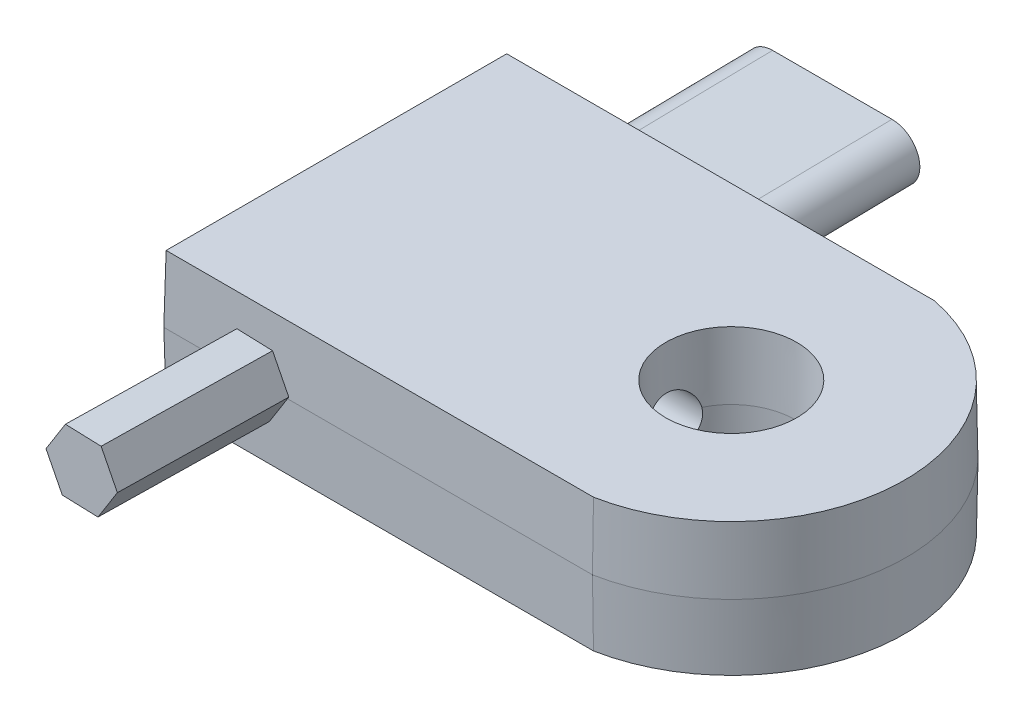
ISO-10303-21;
HEADER;
FILE_DESCRIPTION(('STEP AP214'),'2;1');
FILE_NAME('part.step','',(''),(''),'','','');
FILE_SCHEMA(('AUTOMOTIVE_DESIGN { 1 0 10303 214 1 1 1 1 }'));
ENDSEC;
DATA;
#1=APPLICATION_CONTEXT('core data for automotive mechanical design processes');
#2=APPLICATION_PROTOCOL_DEFINITION('international standard','automotive_design',2000,#1);
#3=PRODUCT_CONTEXT('',#1,'mechanical');
#4=PRODUCT('Part','Part','',(#3));
#5=PRODUCT_RELATED_PRODUCT_CATEGORY('part','',(#4));
#6=PRODUCT_DEFINITION_FORMATION('','',#4);
#7=PRODUCT_DEFINITION_CONTEXT('part definition',#1,'design');
#8=PRODUCT_DEFINITION('design','',#6,#7);
#9=PRODUCT_DEFINITION_SHAPE('','',#8);
#10=(LENGTH_UNIT() NAMED_UNIT(*) SI_UNIT(.MILLI.,.METRE.));
#11=(NAMED_UNIT(*) PLANE_ANGLE_UNIT() SI_UNIT($,.RADIAN.));
#12=(NAMED_UNIT(*) SI_UNIT($,.STERADIAN.) SOLID_ANGLE_UNIT());
#13=UNCERTAINTY_MEASURE_WITH_UNIT(LENGTH_MEASURE(1.E-05),#10,'distance_accuracy_value','');
#14=(GEOMETRIC_REPRESENTATION_CONTEXT(3) GLOBAL_UNCERTAINTY_ASSIGNED_CONTEXT((#13)) GLOBAL_UNIT_ASSIGNED_CONTEXT((#10,
#11,#12)) REPRESENTATION_CONTEXT('',''));
#15=CARTESIAN_POINT('',(0.,0.,0.));
#16=DIRECTION('',(0.,0.,1.));
#17=DIRECTION('',(1.,0.,0.));
#18=AXIS2_PLACEMENT_3D('',#15,#16,#17);
#19=CARTESIAN_POINT('',(-20.8236606349459,0.,42.8909952606635));
#20=DIRECTION('',(0.,0.0174524064372835,0.999847695156391));
#21=DIRECTION('',(0.,-0.999847695156391,0.0174524064372836));
#22=AXIS2_PLACEMENT_3D('',#19,#20,#21);
#23=PLANE('',#22);
#24=DIRECTION('',(0.470462429240425,-0.882285629375395,0.0154003529459803));
#25=VECTOR('',#24,1.);
#26=CARTESIAN_POINT('',(-8.33183183566396,1.02998413402179,42.8730168207291));
#27=LINE('',#26,#25);
#28=CARTESIAN_POINT('',(-8.33183183566396,1.02998413402179,42.8730168207291));
#29=VERTEX_POINT('',#28);
#30=CARTESIAN_POINT('',(-7.78261192134434,0.,42.8909952606635));
#31=VERTEX_POINT('',#30);
#32=EDGE_CURVE('E57',#29,#31,#27,.T.);
#33=ORIENTED_EDGE('',*,*,#32,.F.);
#34=DIRECTION('',(-0.528966944893992,-0.848513176005759,0.0148108525796292));
#35=VECTOR('',#34,1.);
#36=CARTESIAN_POINT('',(-3.92205186967217,8.10368966618908,42.7495448313821));
#37=LINE('',#36,#35);
#38=CARTESIAN_POINT('',(-3.92205186967217,8.10368966618908,42.7495448313821));
#39=VERTEX_POINT('',#38);
#40=EDGE_CURVE('E61',#39,#29,#37,.T.);
#41=ORIENTED_EDGE('',*,*,#40,.F.);
#42=DIRECTION('',(-0.999429374134418,0.0337724533696361,-0.000589500366352779));
#43=VECTOR('',#42,1.);
#44=CARTESIAN_POINT('',(4.40977996599179,7.82214260600055,42.754459253598));
#45=LINE('',#44,#43);
#46=CARTESIAN_POINT('',(4.40977996599179,7.82214260600055,42.754459253598));
#47=VERTEX_POINT('',#46);
#48=EDGE_CURVE('E672',#47,#39,#45,.T.);
#49=ORIENTED_EDGE('',*,*,#48,.F.);
#50=DIRECTION('',(-0.470462429240425,0.882285629375395,-0.0154003529459803));
#51=VECTOR('',#50,1.);
#52=CARTESIAN_POINT('',(8.33183183566396,0.466890013644726,42.882845665161));
#53=LINE('',#52,#51);
#54=CARTESIAN_POINT('',(8.33183183566396,0.466890013644726,42.882845665161));
#55=VERTEX_POINT('',#54);
#56=EDGE_CURVE('E675',#55,#47,#53,.T.);
#57=ORIENTED_EDGE('',*,*,#56,.F.);
#58=DIRECTION('',(0.528966944893993,0.848513176005759,-0.0148108525796292));
#59=VECTOR('',#58,1.);
#60=CARTESIAN_POINT('',(3.92205186967217,-6.60681551852256,43.0063176545081));
#61=LINE('',#60,#59);
#62=CARTESIAN_POINT('',(8.04077049318518,0.,42.8909952606635));
#63=VERTEX_POINT('',#62);
#64=EDGE_CURVE('E11',#63,#55,#61,.T.);
#65=ORIENTED_EDGE('',*,*,#64,.F.);
#66=DIRECTION('',(1.,0.,0.));
#67=VECTOR('',#66,1.);
#68=CARTESIAN_POINT('',(-20.8236606349459,0.,42.8909952606635));
#69=LINE('',#68,#67);
#70=CARTESIAN_POINT('',(79.1763393650541,0.,42.8909952606635));
#71=VERTEX_POINT('',#70);
#72=EDGE_CURVE('E383',#63,#71,#69,.T.);
#73=ORIENTED_EDGE('',*,*,#72,.T.);
#74=CARTESIAN_POINT('',(79.1507149742666,15.540006119552,42.6197434448618));
#75=CARTESIAN_POINT('',(79.1549929061392,12.9500051114954,42.6649520806216));
#76=CARTESIAN_POINT('',(79.1592672379745,10.3600040975045,42.710160716485));
#77=CARTESIAN_POINT('',(79.1678087015704,5.18000205765384,42.8005779884189));
#78=CARTESIAN_POINT('',(79.1720758333309,2.59000103179412,42.8457866244894));
#79=CARTESIAN_POINT('',(79.1763393650541,0.,42.8909952606635));
#80=B_SPLINE_CURVE_WITH_KNOTS('',3,(#74,#75,#76,#77,#78,#79),.UNSPECIFIED.,.F.,.F.,(4,2,4),(0.,
7.77119721074497,15.5423944214898),.UNSPECIFIED.);
#81=CARTESIAN_POINT('',(79.1507149742666,15.540006119552,42.6197434448618));
#82=VERTEX_POINT('',#81);
#83=EDGE_CURVE('E286',#82,#71,#80,.T.);
#84=ORIENTED_EDGE('',*,*,#83,.F.);
#85=DIRECTION('',(-1.,0.,0.));
#86=VECTOR('',#85,1.);
#87=CARTESIAN_POINT('',(-20.8236606349459,15.540006119552,42.6197434448618));
#88=LINE('',#87,#86);
#89=CARTESIAN_POINT('',(-20.5524088191442,15.540006119552,42.6197434448618));
#90=VERTEX_POINT('',#89);
#91=EDGE_CURVE('E373',#90,#82,#88,.F.);
#92=ORIENTED_EDGE('',*,*,#91,.F.);
#93=DIRECTION('',(-0.0174497491606827,-0.999695459881888,0.0174497491606827));
#94=VECTOR('',#93,1.);
#95=CARTESIAN_POINT('',(-20.8236606349459,0.,42.8909952606635));
#96=LINE('',#95,#94);
#97=CARTESIAN_POINT('',(-20.8236606349459,0.,42.8909952606635));
#98=VERTEX_POINT('',#97);
#99=EDGE_CURVE('E294',#90,#98,#96,.T.);
#100=ORIENTED_EDGE('',*,*,#99,.T.);
#101=EDGE_CURVE('E364',#98,#31,#69,.T.);
#102=ORIENTED_EDGE('',*,*,#101,.T.);
#103=EDGE_LOOP('',(#33,#41,#49,#57,#65,#73,#84,#92,#100,#102));
#104=FACE_BOUND('',#103,.T.);
#105=ADVANCED_FACE('F34',(#104),#23,.T.);
#106=CARTESIAN_POINT('',(-20.8236606349459,0.,-37.1090047393365));
#107=DIRECTION('',(-0.999847695156391,-0.0174524064372835,0.));
#108=DIRECTION('',(0.0174524064372835,-0.999847695156391,0.));
#109=AXIS2_PLACEMENT_3D('',#106,#107,#108);
#110=PLANE('',#109);
#111=CARTESIAN_POINT('',(-20.8236606349459,0.,2.89099526066352));
#112=DIRECTION('',(-0.999847695156391,-0.0174524064372835,0.));
#113=DIRECTION('',(-0.0174524064372835,0.999847695156391,0.));
#114=AXIS2_PLACEMENT_3D('',#111,#112,#113);
#115=ELLIPSE('',#114,6.74875771545308,6.74464655459816);
#116=CARTESIAN_POINT('',(-20.8236606349459,0.,-3.85365129393464));
#117=VERTEX_POINT('',#116);
#118=CARTESIAN_POINT('',(-20.8236606349459,0.,9.63564181526168));
#119=VERTEX_POINT('',#118);
#120=EDGE_CURVE('E249',#117,#119,#115,.T.);
#121=ORIENTED_EDGE('',*,*,#120,.F.);
#122=DIRECTION('',(0.,0.,1.));
#123=VECTOR('',#122,1.);
#124=CARTESIAN_POINT('',(-20.8236606349459,0.,-37.1090047393365));
#125=LINE('',#124,#123);
#126=CARTESIAN_POINT('',(-20.8236606349459,0.,-37.1090047393365));
#127=VERTEX_POINT('',#126);
#128=EDGE_CURVE('E380',#127,#117,#125,.T.);
#129=ORIENTED_EDGE('',*,*,#128,.F.);
#130=DIRECTION('',(-0.0174497491606827,0.999695459881887,-0.0174497491606827));
#131=VECTOR('',#130,1.);
#132=CARTESIAN_POINT('',(-20.8236606349459,0.,-37.1090047393365));
#133=LINE('',#132,#131);
#134=CARTESIAN_POINT('',(-20.5524088191442,-15.540006119552,-36.8377529235348));
#135=VERTEX_POINT('',#134);
#136=EDGE_CURVE('E332',#135,#127,#133,.T.);
#137=ORIENTED_EDGE('',*,*,#136,.F.);
#138=DIRECTION('',(0.,0.,1.));
#139=VECTOR('',#138,1.);
#140=CARTESIAN_POINT('',(-20.5524088191442,-15.540006119552,2.89099526066353));
#141=LINE('',#140,#139);
#142=CARTESIAN_POINT('',(-20.5524088191442,-15.540006119552,42.6197434448618));
#143=VERTEX_POINT('',#142);
#144=EDGE_CURVE('E333',#135,#143,#141,.T.);
#145=ORIENTED_EDGE('',*,*,#144,.T.);
#146=DIRECTION('',(-0.0174497491606827,0.999695459881888,0.0174497491606827));
#147=VECTOR('',#146,1.);
#148=CARTESIAN_POINT('',(-20.7993011352842,-1.39555480096098,42.8666357610019));
#149=LINE('',#148,#147);
#150=EDGE_CURVE('E326',#143,#98,#149,.T.);
#151=ORIENTED_EDGE('',*,*,#150,.T.);
#152=EDGE_CURVE('E384',#119,#98,#125,.T.);
#153=ORIENTED_EDGE('',*,*,#152,.F.);
#154=EDGE_LOOP('',(#121,#129,#137,#145,#151,#153));
#155=FACE_BOUND('',#154,.T.);
#156=ADVANCED_FACE('F36',(#155),#110,.T.);
#157=CARTESIAN_POINT('',(-20.8236606349459,0.,-37.1090047393365));
#158=DIRECTION('',(0.,-0.0174524064372835,-0.999847695156391));
#159=DIRECTION('',(0.,0.999847695156391,-0.0174524064372835));
#160=AXIS2_PLACEMENT_3D('',#157,#158,#159);
#161=PLANE('',#160);
#162=DIRECTION('',(-1.,0.,0.));
#163=VECTOR('',#162,1.);
#164=CARTESIAN_POINT('',(-20.8236606349459,0.,-37.1090047393365));
#165=LINE('',#164,#163);
#166=CARTESIAN_POINT('',(79.1763393650541,0.,-37.1090047393365));
#167=VERTEX_POINT('',#166);
#168=CARTESIAN_POINT('',(35.5675113877846,0.,-37.1090047393365));
#169=VERTEX_POINT('',#168);
#170=EDGE_CURVE('E347',#167,#169,#165,.T.);
#171=ORIENTED_EDGE('',*,*,#170,.F.);
#172=CARTESIAN_POINT('',(79.1507149742666,-15.540006119552,-36.8377529235348));
#173=CARTESIAN_POINT('',(79.1549929061392,-12.9500051114954,-36.8829615592946));
#174=CARTESIAN_POINT('',(79.1592672379745,-10.3600040975045,-36.9281701951579));
#175=CARTESIAN_POINT('',(79.1678087015704,-5.18000205765384,-37.0185874670918));
#176=CARTESIAN_POINT('',(79.1720758333309,-2.59000103179412,-37.0637961031624));
#177=CARTESIAN_POINT('',(79.1763393650541,0.,-37.1090047393365));
#178=B_SPLINE_CURVE_WITH_KNOTS('',3,(#172,#173,#174,#175,#176,#177),.UNSPECIFIED.,.F.,.F.,(4,2,
4),(0.,7.77119721074497,15.5423944214898),.UNSPECIFIED.);
#179=CARTESIAN_POINT('',(79.1507149742666,-15.540006119552,-36.8377529235348));
#180=VERTEX_POINT('',#179);
#181=EDGE_CURVE('E325',#180,#167,#178,.T.);
#182=ORIENTED_EDGE('',*,*,#181,.F.);
#183=DIRECTION('',(-1.,0.,0.));
#184=VECTOR('',#183,1.);
#185=CARTESIAN_POINT('',(71.563981042654,-15.540006119552,-36.8377529235348));
#186=LINE('',#185,#184);
#187=EDGE_CURVE('E429',#180,#135,#186,.T.);
#188=ORIENTED_EDGE('',*,*,#187,.T.);
#189=ORIENTED_EDGE('',*,*,#136,.T.);
#190=CARTESIAN_POINT('',(-5.06852298001845,0.,-37.1090047393365));
#191=VERTEX_POINT('',#190);
#192=EDGE_CURVE('E356',#191,#127,#165,.T.);
#193=ORIENTED_EDGE('',*,*,#192,.F.);
#194=EDGE_CURVE('E353',#169,#191,#165,.T.);
#195=ORIENTED_EDGE('',*,*,#194,.F.);
#196=EDGE_LOOP('',(#171,#182,#188,#189,#193,#195));
#197=FACE_BOUND('',#196,.T.);
#198=ADVANCED_FACE('F335',(#197),#161,.T.);
#199=CARTESIAN_POINT('',(71.563981042654,0.,2.89099526066352));
#200=DIRECTION('',(0.,1.,0.));
#201=DIRECTION('',(0.,0.,1.));
#202=AXIS2_PLACEMENT_3D('',#199,#200,#201);
#203=CONICAL_SURFACE('',#202,40.7179075988516,0.0174532925199433);
#204=CARTESIAN_POINT('',(71.563981042654,0.,2.89099526066352));
#205=DIRECTION('',(0.,1.,0.));
#206=DIRECTION('',(0.,0.,1.));
#207=AXIS2_PLACEMENT_3D('',#204,#205,#206);
#208=CIRCLE('',#207,40.7179075988516);
#209=EDGE_CURVE('E360',#71,#167,#208,.T.);
#210=ORIENTED_EDGE('',*,*,#209,.F.);
#211=CARTESIAN_POINT('',(79.1507149742666,-15.540006119552,42.6197434448618));
#212=CARTESIAN_POINT('',(79.1549929061392,-12.9500051114954,42.6649520806216));
#213=CARTESIAN_POINT('',(79.1592672379745,-10.3600040975045,42.710160716485));
#214=CARTESIAN_POINT('',(79.1678087015704,-5.18000205765384,42.8005779884189));
#215=CARTESIAN_POINT('',(79.1720758333309,-2.59000103179412,42.8457866244894));
#216=CARTESIAN_POINT('',(79.1763393650541,0.,42.8909952606635));
#217=B_SPLINE_CURVE_WITH_KNOTS('',3,(#211,#212,#213,#214,#215,#216),.UNSPECIFIED.,.F.,.F.,(4,2,
4),(0.,7.77119721074497,15.5423944214898),.UNSPECIFIED.);
#218=CARTESIAN_POINT('',(79.1507149742666,-15.540006119552,42.6197434448618));
#219=VERTEX_POINT('',#218);
#220=EDGE_CURVE('E318',#219,#71,#217,.T.);
#221=ORIENTED_EDGE('',*,*,#220,.F.);
#222=CARTESIAN_POINT('',(71.563981042654,-15.540006119552,2.89099526066352));
#223=DIRECTION('',(0.,1.,0.));
#224=DIRECTION('',(0.,0.,1.));
#225=AXIS2_PLACEMENT_3D('',#222,#223,#224);
#226=CIRCLE('',#225,40.4466557830499);
#227=EDGE_CURVE('E426',#219,#180,#226,.T.);
#228=ORIENTED_EDGE('',*,*,#227,.T.);
#229=ORIENTED_EDGE('',*,*,#181,.T.);
#230=EDGE_LOOP('',(#210,#221,#228,#229));
#231=FACE_BOUND('',#230,.T.);
#232=ADVANCED_FACE('F314',(#231),#203,.T.);
#233=CARTESIAN_POINT('',(-20.8236606349459,0.,42.8909952606635));
#234=DIRECTION('',(0.,-0.0174524064372835,0.999847695156391));
#235=DIRECTION('',(0.,-0.999847695156391,-0.0174524064372836));
#236=AXIS2_PLACEMENT_3D('',#233,#234,#235);
#237=PLANE('',#236);
#238=ORIENTED_EDGE('',*,*,#101,.F.);
#239=ORIENTED_EDGE('',*,*,#150,.F.);
#240=DIRECTION('',(1.,0.,0.));
#241=VECTOR('',#240,1.);
#242=CARTESIAN_POINT('',(71.563981042654,-15.540006119552,42.6197434448618));
#243=LINE('',#242,#241);
#244=EDGE_CURVE('E424',#143,#219,#243,.T.);
#245=ORIENTED_EDGE('',*,*,#244,.T.);
#246=ORIENTED_EDGE('',*,*,#220,.T.);
#247=ORIENTED_EDGE('',*,*,#72,.F.);
#248=EDGE_CURVE('E385',#31,#63,#69,.T.);
#249=ORIENTED_EDGE('',*,*,#248,.F.);
#250=EDGE_LOOP('',(#238,#239,#245,#246,#247,#249));
#251=FACE_BOUND('',#250,.T.);
#252=ADVANCED_FACE('F309',(#251),#237,.T.);
#253=CARTESIAN_POINT('',(71.563981042654,-15.540006119552,2.89099526066352));
#254=DIRECTION('',(0.,1.,0.));
#255=DIRECTION('',(0.,0.,1.));
#256=AXIS2_PLACEMENT_3D('',#253,#254,#255);
#257=PLANE('',#256);
#258=CARTESIAN_POINT('',(71.563981042654,-15.540006119552,2.89099526066352));
#259=DIRECTION('',(0.,1.,0.));
#260=DIRECTION('',(0.,0.,1.));
#261=AXIS2_PLACEMENT_3D('',#258,#259,#260);
#262=CIRCLE('',#261,15.2712518158017);
#263=CARTESIAN_POINT('',(71.563981042654,-15.540006119552,18.1622470764652));
#264=VERTEX_POINT('',#263);
#265=EDGE_CURVE('E387',#264,#264,#262,.T.);
#266=ORIENTED_EDGE('',*,*,#265,.T.);
#267=EDGE_LOOP('',(#266));
#268=FACE_BOUND('',#267,.T.);
#269=ORIENTED_EDGE('',*,*,#144,.F.);
#270=ORIENTED_EDGE('',*,*,#187,.F.);
#271=ORIENTED_EDGE('',*,*,#227,.F.);
#272=ORIENTED_EDGE('',*,*,#244,.F.);
#273=EDGE_LOOP('',(#269,#270,#271,#272));
#274=FACE_BOUND('',#273,.T.);
#275=ADVANCED_FACE('F306',(#268,#274),#257,.F.);
#276=CARTESIAN_POINT('',(71.563981042654,0.,2.89099526066352));
#277=DIRECTION('',(0.,-1.,0.));
#278=DIRECTION('',(0.,0.,1.));
#279=AXIS2_PLACEMENT_3D('',#276,#277,#278);
#280=CONICAL_SURFACE('',#279,15.,0.0174532925199433);
#281=ORIENTED_EDGE('',*,*,#265,.F.);
#282=EDGE_LOOP('',(#281));
#283=FACE_BOUND('',#282,.T.);
#284=CARTESIAN_POINT('',(71.563981042654,0.,2.89099526066352));
#285=DIRECTION('',(0.,1.,0.));
#286=DIRECTION('',(0.,0.,1.));
#287=AXIS2_PLACEMENT_3D('',#284,#285,#286);
#288=CIRCLE('',#287,15.);
#289=CARTESIAN_POINT('',(58.0952481158299,3.87325147864019E-13,9.49351245836062));
#290=VERTEX_POINT('',#289);
#291=CARTESIAN_POINT('',(58.0952481158293,0.,-3.71152193703216));
#292=VERTEX_POINT('',#291);
#293=EDGE_CURVE('E379',#290,#292,#288,.T.);
#294=ORIENTED_EDGE('',*,*,#293,.T.);
#295=CARTESIAN_POINT('',(58.0951969682448,0.000618613716306285,-3.71139306620587));
#296=CARTESIAN_POINT('',(58.1091875569078,-0.168091861959878,-3.74657443787403));
#297=CARTESIAN_POINT('',(58.120104336262,-0.338412158726245,-3.77532233842051));
#298=CARTESIAN_POINT('',(58.1355229194946,-0.681032170253793,-3.81974232678182));
#299=CARTESIAN_POINT('',(58.1400248183973,-0.853331855655936,-3.83541460828596));
#300=CARTESIAN_POINT('',(58.1423426546728,-1.19807170511065,-3.85344396562097));
#301=CARTESIAN_POINT('',(58.1401819160055,-1.37050927121765,-3.85584740951008));
#302=CARTESIAN_POINT('',(58.1292375173013,-1.71483969011911,-3.8474460858475));
#303=CARTESIAN_POINT('',(58.1204542247258,-1.88673257260469,-3.83664205111007));
#304=CARTESIAN_POINT('',(58.0964806194382,-2.22880015593477,-3.80194814602016));
#305=CARTESIAN_POINT('',(58.081287990786,-2.3989742129197,-3.77805354460823));
#306=CARTESIAN_POINT('',(58.0449157344092,-2.73643149807855,-3.71743351826992));
#307=CARTESIAN_POINT('',(58.0237338175287,-2.90371359492954,-3.68070318615116));
#308=CARTESIAN_POINT('',(57.9759801889729,-3.23425737680185,-3.59479287233732));
#309=CARTESIAN_POINT('',(57.9494083740942,-3.39751898477347,-3.54561265225275));
#310=CARTESIAN_POINT('',(57.8915860129731,-3.71913915976902,-3.4352385426739));
#311=CARTESIAN_POINT('',(57.8603336373622,-3.87749578037359,-3.37403995294969));
#312=CARTESIAN_POINT('',(57.7930744255752,-4.19258837317654,-3.23834560122027));
#313=CARTESIAN_POINT('',(57.7569626572284,-4.34916730738855,-3.16353756255143));
#314=CARTESIAN_POINT('',(57.6815773828327,-4.65550265526943,-3.0023268437978));
#315=CARTESIAN_POINT('',(57.6423028197638,-4.80525676164758,-2.91592028094723));
#316=CARTESIAN_POINT('',(57.5615361577302,-5.09726024738508,-2.73205726867836));
#317=CARTESIAN_POINT('',(57.5200433174761,-5.23950708605805,-2.63459711308591));
#318=CARTESIAN_POINT('',(57.4357994480805,-5.51583055987855,-2.42919700870098));
#319=CARTESIAN_POINT('',(57.3930483460093,-5.64990672005931,-2.32125645162009));
#320=CARTESIAN_POINT('',(57.3029788575362,-5.92213447499435,-2.08426815516597));
#321=CARTESIAN_POINT('',(57.2556267726558,-6.05937857808544,-1.95418869539177));
#322=CARTESIAN_POINT('',(57.1617605033109,-6.32249683470245,-1.6828011481619));
#323=CARTESIAN_POINT('',(57.1152460808177,-6.44837426031992,-1.54149631428013));
#324=CARTESIAN_POINT('',(57.0241860205248,-6.68811396918517,-1.2483042467329));
#325=CARTESIAN_POINT('',(56.9796414362742,-6.80196986694446,-1.0964114594568));
#326=CARTESIAN_POINT('',(56.8936902753573,-7.01676882364325,-0.783007901160341));
#327=CARTESIAN_POINT('',(56.8522823907361,-7.11771727700078,-0.62150118972756));
#328=CARTESIAN_POINT('',(56.7729311929509,-7.30768568873573,-0.286726694620773));
#329=CARTESIAN_POINT('',(56.7350644972986,-7.39645559252331,-0.113298538885881));
#330=CARTESIAN_POINT('',(56.6647161061734,-7.55900153423048,0.241415997267015));
#331=CARTESIAN_POINT('',(56.6322321302722,-7.6327839247265,0.422699008643849));
#332=CARTESIAN_POINT('',(56.5735587019017,-7.76461342433333,0.791835424469197));
#333=CARTESIAN_POINT('',(56.5473674137851,-7.82266512289565,0.979686894463411));
#334=CARTESIAN_POINT('',(56.5020392131953,-7.92238276849667,1.36051869395713));
#335=CARTESIAN_POINT('',(56.4829016696564,-7.96405018138314,1.55349856298581));
#336=CARTESIAN_POINT('',(56.4534100607895,-8.02798171366356,1.92829627609191));
#337=CARTESIAN_POINT('',(56.4425039435678,-8.05146879128867,2.10986292743562));
#338=CARTESIAN_POINT('',(56.4275065513695,-8.08371778787449,2.47457558318418));
#339=CARTESIAN_POINT('',(56.4234148765629,-8.0924805707671,2.65772149429386));
#340=CARTESIAN_POINT('',(56.4221562293902,-8.09517883237481,3.02410123059205));
#341=CARTESIAN_POINT('',(56.4249876131722,-8.0891178309365,3.20733502458387));
#342=CARTESIAN_POINT('',(56.4374955286955,-8.06224720344145,3.57247937606798));
#343=CARTESIAN_POINT('',(56.4471719279325,-8.04143786287958,3.75438995910581));
#344=CARTESIAN_POINT('',(56.4724418881756,-7.98675907222658,4.1061690138727));
#345=CARTESIAN_POINT('',(56.4877050343834,-7.95361744615489,4.27617516578254));
#346=CARTESIAN_POINT('',(56.5238023731273,-7.87459853701638,4.6126532890519));
#347=CARTESIAN_POINT('',(56.5446383694661,-7.82871713019334,4.77912409723741));
#348=CARTESIAN_POINT('',(56.5913951516865,-7.72466254035002,5.10738105721447));
#349=CARTESIAN_POINT('',(56.6173143912293,-7.66649309497645,5.26916861653167));
#350=CARTESIAN_POINT('',(56.6736771585853,-7.53832254269426,5.58723710619018));
#351=CARTESIAN_POINT('',(56.7041224117341,-7.46831692238167,5.74351590834084));
#352=CARTESIAN_POINT('',(56.7701197443781,-7.31411827386523,6.05555123035368));
#353=CARTESIAN_POINT('',(56.8058229508874,-7.22948393687426,6.21105762173128));
#354=CARTESIAN_POINT('',(56.8806054045121,-7.04864112698926,6.51440040795376));
#355=CARTESIAN_POINT('',(56.9196858057178,-6.95242869306335,6.66223415297858));
#356=CARTESIAN_POINT('',(57.0003681981819,-6.74904125983466,6.9495013142743));
#357=CARTESIAN_POINT('',(57.0419710210992,-6.64186263681223,7.08893192943273));
#358=CARTESIAN_POINT('',(57.1267861447881,-6.41718165855263,7.3586917477621));
#359=CARTESIAN_POINT('',(57.1699985310862,-6.29967875426805,7.48902046622997));
#360=CARTESIAN_POINT('',(57.2606239060242,-6.0450411234447,7.75013223127722));
#361=CARTESIAN_POINT('',(57.3080937579864,-5.90708718403863,7.88009795872799));
#362=CARTESIAN_POINT('',(57.4025831870089,-5.62062853983375,8.12790914441457));
#363=CARTESIAN_POINT('',(57.4496028953683,-5.47212702500793,8.24575824099453));
#364=CARTESIAN_POINT('',(57.5419774010359,-5.16524233544281,8.46870929939505));
#365=CARTESIAN_POINT('',(57.587331450552,-5.0068548065072,8.57380558350923));
#366=CARTESIAN_POINT('',(57.6750629652635,-4.68116555738852,8.7704094830751));
#367=CARTESIAN_POINT('',(57.7174417075442,-4.51386771666232,8.86192294767816));
#368=CARTESIAN_POINT('',(57.7986068111273,-4.16857278801214,9.03197714309193));
#369=CARTESIAN_POINT('',(57.8373273019626,-3.99045004711947,9.11029478763869));
#370=CARTESIAN_POINT('',(57.9091279602582,-3.62714125189009,9.25138956871243));
#371=CARTESIAN_POINT('',(57.9422108428272,-3.44195865051416,9.3141741926629));
#372=CARTESIAN_POINT('',(58.0015796345391,-3.06591605295179,9.4234884617912));
#373=CARTESIAN_POINT('',(58.0278699746013,-2.87505984885459,9.47002871050906));
#374=CARTESIAN_POINT('',(58.072711011388,-2.48913439932648,9.54628761397526));
#375=CARTESIAN_POINT('',(58.0912629812055,-2.29406585245567,9.57600903599282));
#376=CARTESIAN_POINT('',(58.118329748357,-1.92359023174051,9.61582817700945));
#377=CARTESIAN_POINT('',(58.1277396773469,-1.74844317453271,9.6277590517232));
#378=CARTESIAN_POINT('',(58.1396850630974,-1.39751796221475,9.6379003467718));
#379=CARTESIAN_POINT('',(58.1422208417925,-1.22173983704523,9.63611140965647));
#380=CARTESIAN_POINT('',(58.1403891203976,-0.870243394614929,9.61879065062736));
#381=CARTESIAN_POINT('',(58.1359956904585,-0.694527774886414,9.6032073043788));
#382=CARTESIAN_POINT('',(58.1205339772523,-0.345110402457246,9.55844188990938));
#383=CARTESIAN_POINT('',(58.1094648824965,-0.171408897207573,9.52925816853568));
#384=CARTESIAN_POINT('',(58.0951969682448,0.000618613716306009,9.4933835875329));
#385=B_SPLINE_CURVE_WITH_KNOTS('',3,(#295,#296,#297,#298,#299,#300,#301,#302,#303,#304,#305,
#306,#307,#308,#309,#310,#311,#312,#313,#314,#315,#316,#317,#318,#319,#320,#321,#322,#323,#324,
#325,#326,#327,#328,#329,#330,#331,#332,#333,#334,#335,#336,#337,#338,#339,#340,#341,#342,#343,
#344,#345,#346,#347,#348,#349,#350,#351,#352,#353,#354,#355,#356,#357,#358,#359,#360,#361,#362,
#363,#364,#365,#366,#367,#368,#369,#370,#371,#372,#373,#374,#375,#376,#377,#378,#379,#380,#381,
#382,#383,#384),.UNSPECIFIED.,.F.,.F.,(4,2,2,2,2,2,2,2,2,2,2,2,2,2,2,2,2,2,2,2,2,2,2,2,2,2,2,2,
2,2,2,2,2,2,2,2,2,2,2,2,2,2,2,2,4),(0.,0.518587366554513,1.03716705113127,1.55393340233247,
2.07067108215944,2.58759563938084,3.10471803717854,3.62185033754526,4.13918528592131,
4.67037797980525,5.20174894331716,5.73329860058459,6.26487912775699,6.84901224236017,
7.43297666464823,8.01724972783553,8.60127780158952,9.19591713429167,9.79030389604542,
10.3845170574593,10.9786770444877,11.5281805558863,12.0776518246412,12.6269926363712,
13.1763228143819,13.6973611583886,14.2185683549819,14.739617243923,15.2608652706831,
15.8021138328085,16.3435480930294,16.8851618487544,17.4268044250637,18.0122946890082,
18.5976086271211,19.1831822053475,19.7685028825975,20.3628968737333,20.9570037868405,
21.5507221673278,22.1443428325168,22.6711053959306,23.1978432892447,23.7265569742575,
24.2553349422472),.UNSPECIFIED.);
#386=EDGE_CURVE('E243',#292,#290,#385,.T.);
#387=ORIENTED_EDGE('',*,*,#386,.T.);
#388=EDGE_LOOP('',(#294,#387));
#389=FACE_BOUND('',#388,.T.);
#390=ADVANCED_FACE('F251',(#283,#389),#280,.F.);
#391=CARTESIAN_POINT('',(71.563981042654,15.540006119552,2.89099526066352));
#392=DIRECTION('',(0.,1.,0.));
#393=DIRECTION('',(0.,0.,1.));
#394=AXIS2_PLACEMENT_3D('',#391,#392,#393);
#395=PLANE('',#394);
#396=DIRECTION('',(0.,0.,-1.));
#397=VECTOR('',#396,1.);
#398=CARTESIAN_POINT('',(-20.5524088191442,15.540006119552,-37.1090047393365));
#399=LINE('',#398,#397);
#400=CARTESIAN_POINT('',(-20.5524088191442,15.540006119552,-36.8377529235348));
#401=VERTEX_POINT('',#400);
#402=EDGE_CURVE('E295',#401,#90,#399,.F.);
#403=ORIENTED_EDGE('',*,*,#402,.T.);
#404=ORIENTED_EDGE('',*,*,#91,.T.);
#405=CARTESIAN_POINT('',(71.563981042654,15.540006119552,2.89099526066352));
#406=DIRECTION('',(0.,1.,0.));
#407=DIRECTION('',(0.,0.,1.));
#408=AXIS2_PLACEMENT_3D('',#405,#406,#407);
#409=CIRCLE('',#408,40.4466557830499);
#410=CARTESIAN_POINT('',(79.1507149742666,15.540006119552,-36.8377529235348));
#411=VERTEX_POINT('',#410);
#412=EDGE_CURVE('E371',#82,#411,#409,.T.);
#413=ORIENTED_EDGE('',*,*,#412,.T.);
#414=DIRECTION('',(1.,0.,0.));
#415=VECTOR('',#414,1.);
#416=CARTESIAN_POINT('',(-20.8236606349459,15.540006119552,-36.8377529235348));
#417=LINE('',#416,#415);
#418=EDGE_CURVE('E367',#411,#401,#417,.F.);
#419=ORIENTED_EDGE('',*,*,#418,.T.);
#420=EDGE_LOOP('',(#403,#404,#413,#419));
#421=FACE_BOUND('',#420,.T.);
#422=CARTESIAN_POINT('',(71.563981042654,15.540006119552,2.89099526066352));
#423=DIRECTION('',(0.,1.,0.));
#424=DIRECTION('',(0.,0.,1.));
#425=AXIS2_PLACEMENT_3D('',#422,#423,#424);
#426=CIRCLE('',#425,15.2712518158017);
#427=CARTESIAN_POINT('',(71.563981042654,15.540006119552,18.1622470764652));
#428=VERTEX_POINT('',#427);
#429=EDGE_CURVE('E376',#428,#428,#426,.T.);
#430=ORIENTED_EDGE('',*,*,#429,.F.);
#431=EDGE_LOOP('',(#430));
#432=FACE_BOUND('',#431,.T.);
#433=ADVANCED_FACE('F264',(#421,#432),#395,.T.);
#434=CARTESIAN_POINT('',(-20.8236606349459,0.,-37.1090047393365));
#435=DIRECTION('',(-0.999847695156391,0.0174524064372835,0.));
#436=DIRECTION('',(-0.0174524064372835,-0.999847695156391,0.));
#437=AXIS2_PLACEMENT_3D('',#434,#435,#436);
#438=PLANE('',#437);
#439=ORIENTED_EDGE('',*,*,#128,.T.);
#440=CARTESIAN_POINT('',(-20.8236606349459,0.,2.89099526066352));
#441=DIRECTION('',(-0.999847695156391,0.0174524064372835,0.));
#442=DIRECTION('',(-0.0174524064372835,-0.999847695156391,0.));
#443=AXIS2_PLACEMENT_3D('',#440,#441,#442);
#444=CIRCLE('',#443,6.74464655459816);
#445=EDGE_CURVE('E241',#119,#117,#444,.T.);
#446=ORIENTED_EDGE('',*,*,#445,.F.);
#447=ORIENTED_EDGE('',*,*,#152,.T.);
#448=ORIENTED_EDGE('',*,*,#99,.F.);
#449=ORIENTED_EDGE('',*,*,#402,.F.);
#450=DIRECTION('',(-0.0174497491606827,-0.999695459881887,-0.0174497491606827));
#451=VECTOR('',#450,1.);
#452=CARTESIAN_POINT('',(-20.8236606349459,0.,-37.1090047393365));
#453=LINE('',#452,#451);
#454=EDGE_CURVE('E287',#401,#127,#453,.T.);
#455=ORIENTED_EDGE('',*,*,#454,.T.);
#456=EDGE_LOOP('',(#439,#446,#447,#448,#449,#455));
#457=FACE_BOUND('',#456,.T.);
#458=ADVANCED_FACE('F268',(#457),#438,.T.);
#459=CARTESIAN_POINT('',(71.563981042654,0.,2.89099526066352));
#460=DIRECTION('',(0.,-1.,0.));
#461=DIRECTION('',(0.,0.,1.));
#462=AXIS2_PLACEMENT_3D('',#459,#460,#461);
#463=CONICAL_SURFACE('',#462,40.7179075988516,0.0174532925199433);
#464=ORIENTED_EDGE('',*,*,#209,.T.);
#465=CARTESIAN_POINT('',(79.1507149742666,15.540006119552,-36.8377529235348));
#466=CARTESIAN_POINT('',(79.1549929061392,12.9500051114954,-36.8829615592946));
#467=CARTESIAN_POINT('',(79.1592672379745,10.3600040975045,-36.9281701951579));
#468=CARTESIAN_POINT('',(79.1678087015704,5.18000205765384,-37.0185874670918));
#469=CARTESIAN_POINT('',(79.1720758333309,2.59000103179412,-37.0637961031624));
#470=CARTESIAN_POINT('',(79.1763393650541,0.,-37.1090047393365));
#471=B_SPLINE_CURVE_WITH_KNOTS('',3,(#465,#466,#467,#468,#469,#470),.UNSPECIFIED.,.F.,.F.,(4,2,
4),(0.,7.77119721074497,15.5423944214898),.UNSPECIFIED.);
#472=EDGE_CURVE('E279',#411,#167,#471,.T.);
#473=ORIENTED_EDGE('',*,*,#472,.F.);
#474=ORIENTED_EDGE('',*,*,#412,.F.);
#475=ORIENTED_EDGE('',*,*,#83,.T.);
#476=EDGE_LOOP('',(#464,#473,#474,#475));
#477=FACE_BOUND('',#476,.T.);
#478=ADVANCED_FACE('F274',(#477),#463,.T.);
#479=CARTESIAN_POINT('',(-20.8236606349459,0.,-37.1090047393365));
#480=DIRECTION('',(0.,0.0174524064372835,-0.999847695156391));
#481=DIRECTION('',(0.,0.999847695156391,0.0174524064372835));
#482=AXIS2_PLACEMENT_3D('',#479,#480,#481);
#483=PLANE('',#482);
#484=CARTESIAN_POINT('',(29.1763393650541,0.,-37.1090047393365));
#485=DIRECTION('',(0.,0.0174524064372835,-0.999847695156391));
#486=DIRECTION('',(0.,0.999847695156391,0.0174524064372835));
#487=AXIS2_PLACEMENT_3D('',#484,#485,#486);
#488=CIRCLE('',#487,6.39117202273052);
#489=CARTESIAN_POINT('',(29.1763393650541,6.39019861627512,-36.9974634075852));
#490=VERTEX_POINT('',#489);
#491=EDGE_CURVE('E205',#490,#169,#488,.T.);
#492=ORIENTED_EDGE('',*,*,#491,.F.);
#493=DIRECTION('',(1.,0.,0.));
#494=VECTOR('',#493,1.);
#495=CARTESIAN_POINT('',(29.1763393650541,6.39019861627512,-36.9974634075852));
#496=LINE('',#495,#494);
#497=CARTESIAN_POINT('',(1.32264904271207,6.39019861627512,-36.9974634075852));
#498=VERTEX_POINT('',#497);
#499=EDGE_CURVE('E215',#498,#490,#496,.T.);
#500=ORIENTED_EDGE('',*,*,#499,.F.);
#501=CARTESIAN_POINT('',(1.32264904271207,0.,-37.1090047393365));
#502=DIRECTION('',(0.,0.0174524064372835,-0.999847695156391));
#503=DIRECTION('',(0.,0.999847695156391,0.0174524064372835));
#504=AXIS2_PLACEMENT_3D('',#501,#502,#503);
#505=CIRCLE('',#504,6.39117202273052);
#506=EDGE_CURVE('E48',#191,#498,#505,.T.);
#507=ORIENTED_EDGE('',*,*,#506,.F.);
#508=ORIENTED_EDGE('',*,*,#192,.T.);
#509=ORIENTED_EDGE('',*,*,#454,.F.);
#510=ORIENTED_EDGE('',*,*,#418,.F.);
#511=ORIENTED_EDGE('',*,*,#472,.T.);
#512=ORIENTED_EDGE('',*,*,#170,.T.);
#513=EDGE_LOOP('',(#492,#500,#507,#508,#509,#510,#511,#512));
#514=FACE_BOUND('',#513,.T.);
#515=ADVANCED_FACE('F270',(#514),#483,.T.);
#516=CARTESIAN_POINT('',(71.563981042654,0.,2.89099526066352));
#517=DIRECTION('',(0.,1.,0.));
#518=DIRECTION('',(0.,0.,1.));
#519=AXIS2_PLACEMENT_3D('',#516,#517,#518);
#520=CONICAL_SURFACE('',#519,15.,0.0174532925199433);
#521=CARTESIAN_POINT('',(58.0953133556857,-0.000537180965637111,-3.71163371893591));
#522=CARTESIAN_POINT('',(58.07258570577,0.186888855123823,-3.67266021374055));
#523=CARTESIAN_POINT('',(58.0462239596719,0.372178286312851,-3.62581720800185));
#524=CARTESIAN_POINT('',(57.9872922724116,0.737148780337813,-3.51709773488041));
#525=CARTESIAN_POINT('',(57.9547265115351,0.916833525296983,-3.4552313826123));
#526=CARTESIAN_POINT('',(57.8845208097233,1.26897606102881,-3.31732744950619));
#527=CARTESIAN_POINT('',(57.8468966638402,1.44145424093337,-3.2413337101873));
#528=CARTESIAN_POINT('',(57.7676415995508,1.77881267698894,-3.07573636237328));
#529=CARTESIAN_POINT('',(57.7260100216831,1.94369167599722,-2.98613051246677));
#530=CARTESIAN_POINT('',(57.6400197589071,2.26457878548785,-2.79422511996217));
#531=CARTESIAN_POINT('',(57.5956676825894,2.42060674882658,-2.69195576767057));
#532=CARTESIAN_POINT('',(57.5053181054019,2.72343677523749,-2.47521069352941));
#533=CARTESIAN_POINT('',(57.4593205518323,2.87023854240658,-2.36073458050112));
#534=CARTESIAN_POINT('',(57.3667889801215,3.15401736283455,-2.12009254512674));
#535=CARTESIAN_POINT('',(57.3202544638469,3.29098426970132,-1.99391484945151));
#536=CARTESIAN_POINT('',(57.2278278230644,3.55419779114183,-1.73060464918416));
#537=CARTESIAN_POINT('',(57.1819357284467,3.68044390828002,-1.59347163684694));
#538=CARTESIAN_POINT('',(57.0894780413321,3.92794175050128,-1.30126602811554));
#539=CARTESIAN_POINT('',(57.0430088496686,4.048560223421,-1.14562535275226));
#540=CARTESIAN_POINT('',(56.9532786350151,4.2760955697441,-0.823841644076238));
#541=CARTESIAN_POINT('',(56.9100164578053,4.38301738282612,-0.657702429508853));
#542=CARTESIAN_POINT('',(56.8278819497468,4.58224726701364,-0.315897512610942));
#543=CARTESIAN_POINT('',(56.7890084633698,4.67455918744162,-0.140234336024644));
#544=CARTESIAN_POINT('',(56.7167497563417,4.84365810221763,0.219496820705128));
#545=CARTESIAN_POINT('',(56.6833641225035,4.92044626546802,0.403564166754073));
#546=CARTESIAN_POINT('',(56.6245488427984,5.05425121321481,0.769564214780785));
#547=CARTESIAN_POINT('',(56.5988098091201,5.11205165127343,0.951160574769525));
#548=CARTESIAN_POINT('',(56.5539176510226,5.21212236826647,1.3193726750336));
#549=CARTESIAN_POINT('',(56.5347638764004,5.25439418046556,1.50598791780096));
#550=CARTESIAN_POINT('',(56.503607137022,5.32285104960477,1.88263963865034));
#551=CARTESIAN_POINT('',(56.4916005013806,5.34904436493467,2.07267430869694));
#552=CARTESIAN_POINT('',(56.4750843909544,5.38501712254786,2.45461000238949));
#553=CARTESIAN_POINT('',(56.4705743348452,5.39479783755096,2.64651088015898));
#554=CARTESIAN_POINT('',(56.4692475571893,5.39767722759139,3.01308973042012));
#555=CARTESIAN_POINT('',(56.4717720547903,5.39220437707657,3.18775600151201));
#556=CARTESIAN_POINT('',(56.4830694562045,5.36763375201956,3.53598245518178));
#557=CARTESIAN_POINT('',(56.4918443481017,5.34853164236983,3.70954226809827));
#558=CARTESIAN_POINT('',(56.5154212516949,5.29692674055923,4.0541650072586));
#559=CARTESIAN_POINT('',(56.5302208193945,5.26442938230653,4.22522891688784));
#560=CARTESIAN_POINT('',(56.5654907087517,5.18637779416126,4.56381571616061));
#561=CARTESIAN_POINT('',(56.5859631880963,5.14081859598047,4.73133723231209));
#562=CARTESIAN_POINT('',(56.6318736836119,5.03760299540313,5.06012680229216));
#563=CARTESIAN_POINT('',(56.6572624789599,4.98006611375044,5.22143925996845));
#564=CARTESIAN_POINT('',(56.7125544769847,4.85316955497632,5.5385674053171));
#565=CARTESIAN_POINT('',(56.7424592925743,4.78380565264478,5.69438110446017));
#566=CARTESIAN_POINT('',(56.8379873123358,4.55883619788701,6.15222007492012));
#567=CARTESIAN_POINT('',(56.9094612712717,4.38627190205949,6.4448986359845));
#568=CARTESIAN_POINT('',(57.0681118746772,3.98576690880529,7.02115308231882));
#569=CARTESIAN_POINT('',(57.1560813846399,3.75453847091443,7.30220289975951));
#570=CARTESIAN_POINT('',(57.335490769276,3.2504817196138,7.82368977049488));
#571=CARTESIAN_POINT('',(57.4269343902051,2.97760748339742,8.06408136538188));
#572=CARTESIAN_POINT('',(57.5636974498995,2.53020173979046,8.39872368347107));
#573=CARTESIAN_POINT('',(57.6108780094907,2.3681990117377,8.50931944876154));
#574=CARTESIAN_POINT('',(57.7023799135039,2.03468170327122,8.71641577540096));
#575=CARTESIAN_POINT('',(57.7467023703504,1.86317087251163,8.81292183942759));
#576=CARTESIAN_POINT('',(57.8310455572584,1.51197048473575,8.99088091316461));
#577=CARTESIAN_POINT('',(57.8710749284774,1.33229843403352,9.07236440767172));
#578=CARTESIAN_POINT('',(57.9455985890795,0.965642920037795,9.21969280295825));
#579=CARTESIAN_POINT('',(57.9800967586603,0.778664697637754,9.28554868238509));
#580=CARTESIAN_POINT('',(58.0270862494393,0.491882790660756,9.37260282269272));
#581=CARTESIAN_POINT('',(58.0420740466804,0.394288538897331,9.39986480102463));
#582=CARTESIAN_POINT('',(58.0701479189885,0.19781646861211,9.45002557371321));
#583=CARTESIAN_POINT('',(58.0832357890703,0.0989399590519029,9.47292849287622));
#584=CARTESIAN_POINT('',(58.0953133556857,-0.000537180965636772,9.49362424026293));
#585=B_SPLINE_CURVE_WITH_KNOTS('',3,(#521,#522,#523,#524,#525,#526,#527,#528,#529,#530,#531,
#532,#533,#534,#535,#536,#537,#538,#539,#540,#541,#542,#543,#544,#545,#546,#547,#548,#549,#550,
#551,#552,#553,#554,#555,#556,#557,#558,#559,#560,#561,#562,#563,#564,#565,#566,#567,#568,#569,
#570,#571,#572,#573,#574,#575,#576,#577,#578,#579,#580,#581,#582,#583,#584),.UNSPECIFIED.,.F.,
.F.,(4,2,2,2,2,2,2,2,2,2,2,2,2,2,2,2,2,2,2,2,2,2,2,2,2,2,2,2,2,2,2,4),(0.,0.578050919923076,
1.15571371606153,1.73161290316359,2.30760702256782,2.88225347299372,3.45691834411753,
4.0321678096443,4.6074439516917,5.21364337600398,5.81962355623023,6.42544380986374,
7.03121842965466,7.60734844495981,8.18342155906898,8.75919853692476,9.33493086392618,
9.85860356939912,10.3824429156333,10.9060699703306,11.4298964601354,11.9487269783858,
12.4677432389963,13.5049731840311,14.6237753340482,15.7438202215072,16.3484520074754,
16.9528470215472,17.5560017227137,18.1587314353406,18.4659261691412,18.7728287554676),.UNSPECIFIED.);
#586=EDGE_CURVE('E38',#292,#290,#585,.T.);
#587=ORIENTED_EDGE('',*,*,#586,.F.);
#588=ORIENTED_EDGE('',*,*,#293,.F.);
#589=EDGE_LOOP('',(#587,#588));
#590=FACE_BOUND('',#589,.T.);
#591=ORIENTED_EDGE('',*,*,#429,.T.);
#592=EDGE_LOOP('',(#591));
#593=FACE_BOUND('',#592,.T.);
#594=ADVANCED_FACE('F260',(#590,#593),#520,.F.);
#595=CARTESIAN_POINT('',(72.4819226458055,-1.62865501433073,2.89099526066351));
#596=DIRECTION('',(-0.999847695156391,0.0174524064372835,0.));
#597=DIRECTION('',(-0.0174524064372835,-0.999847695156391,0.));
#598=AXIS2_PLACEMENT_3D('',#595,#596,#597);
#599=CYLINDRICAL_SURFACE('',#598,6.74464655459816);
#600=ORIENTED_EDGE('',*,*,#120,.T.);
#601=ORIENTED_EDGE('',*,*,#445,.T.);
#602=EDGE_LOOP('',(#600,#601));
#603=FACE_BOUND('',#602,.T.);
#604=ORIENTED_EDGE('',*,*,#586,.T.);
#605=ORIENTED_EDGE('',*,*,#386,.F.);
#606=EDGE_LOOP('',(#604,#605));
#607=FACE_BOUND('',#606,.T.);
#608=ADVANCED_FACE('F254',(#603,#607),#599,.F.);
#609=CARTESIAN_POINT('',(29.1763393650541,0.,-37.1090047393365));
#610=DIRECTION('',(0.,0.0174524064372835,-0.999847695156391));
#611=DIRECTION('',(0.,0.999847695156391,0.0174524064372835));
#612=AXIS2_PLACEMENT_3D('',#609,#610,#611);
#613=PLANE('',#612);
#614=CARTESIAN_POINT('',(29.1763393650541,-6.39019861627512,-37.2205460710878));
#615=VERTEX_POINT('',#614);
#616=EDGE_CURVE('E203',#169,#615,#488,.T.);
#617=ORIENTED_EDGE('',*,*,#616,.F.);
#618=ORIENTED_EDGE('',*,*,#194,.T.);
#619=CARTESIAN_POINT('',(1.32264904271207,-6.39019861627512,-37.2205460710878));
#620=VERTEX_POINT('',#619);
#621=EDGE_CURVE('E225',#620,#191,#505,.T.);
#622=ORIENTED_EDGE('',*,*,#621,.F.);
#623=DIRECTION('',(-1.,0.,0.));
#624=VECTOR('',#623,1.);
#625=CARTESIAN_POINT('',(29.1763393650541,-6.39019861627512,-37.2205460710878));
#626=LINE('',#625,#624);
#627=EDGE_CURVE('E223',#615,#620,#626,.T.);
#628=ORIENTED_EDGE('',*,*,#627,.F.);
#629=EDGE_LOOP('',(#617,#618,#622,#628));
#630=FACE_BOUND('',#629,.T.);
#631=ADVANCED_FACE('F259',(#630),#613,.F.);
#632=CARTESIAN_POINT('',(29.1763393650541,0.698096257491342,-77.1029125455921));
#633=DIRECTION('',(0.,-0.0174524064372835,0.999847695156391));
#634=DIRECTION('',(0.,-0.999847695156391,-0.0174524064372835));
#635=AXIS2_PLACEMENT_3D('',#632,#633,#634);
#636=CYLINDRICAL_SURFACE('',#635,6.39117202273052);
#637=ORIENTED_EDGE('',*,*,#491,.T.);
#638=ORIENTED_EDGE('',*,*,#616,.T.);
#639=DIRECTION('',(0.,-0.0174524064372835,0.999847695156391));
#640=VECTOR('',#639,1.);
#641=CARTESIAN_POINT('',(29.1763393650541,-5.69210235878378,-77.2144538773434));
#642=LINE('',#641,#640);
#643=CARTESIAN_POINT('',(29.1763393650541,-5.69210235878378,-77.2144538773434));
#644=VERTEX_POINT('',#643);
#645=EDGE_CURVE('E238',#644,#615,#642,.T.);
#646=ORIENTED_EDGE('',*,*,#645,.F.);
#647=CARTESIAN_POINT('',(29.1763393650541,0.698096257491342,-77.1029125455921));
#648=DIRECTION('',(0.,0.0174524064372835,-0.999847695156391));
#649=DIRECTION('',(0.,0.999847695156391,0.0174524064372835));
#650=AXIS2_PLACEMENT_3D('',#647,#648,#649);
#651=CIRCLE('',#650,6.39117202273052);
#652=CARTESIAN_POINT('',(29.1763393650541,7.08829487376646,-76.9913712138409));
#653=VERTEX_POINT('',#652);
#654=EDGE_CURVE('E211',#653,#644,#651,.T.);
#655=ORIENTED_EDGE('',*,*,#654,.F.);
#656=DIRECTION('',(0.,-0.0174524064372835,0.999847695156391));
#657=VECTOR('',#656,1.);
#658=CARTESIAN_POINT('',(29.1763393650541,7.08829487376646,-76.9913712138409));
#659=LINE('',#658,#657);
#660=EDGE_CURVE('E220',#653,#490,#659,.T.);
#661=ORIENTED_EDGE('',*,*,#660,.T.);
#662=EDGE_LOOP('',(#637,#638,#646,#655,#661));
#663=FACE_BOUND('',#662,.T.);
#664=ADVANCED_FACE('F262',(#663),#636,.T.);
#665=CARTESIAN_POINT('',(29.1763393650541,-5.69210235878378,-77.2144538773434));
#666=DIRECTION('',(0.,0.999847695156391,0.0174524064372835));
#667=DIRECTION('',(0.,-0.0174524064372835,0.999847695156391));
#668=AXIS2_PLACEMENT_3D('',#665,#666,#667);
#669=PLANE('',#668);
#670=ORIENTED_EDGE('',*,*,#627,.T.);
#671=DIRECTION('',(0.,-0.0174524064372835,0.999847695156391));
#672=VECTOR('',#671,1.);
#673=CARTESIAN_POINT('',(1.32264904271207,-5.69210235878378,-77.2144538773434));
#674=LINE('',#673,#672);
#675=CARTESIAN_POINT('',(1.32264904271207,-5.69210235878378,-77.2144538773434));
#676=VERTEX_POINT('',#675);
#677=EDGE_CURVE('E235',#676,#620,#674,.T.);
#678=ORIENTED_EDGE('',*,*,#677,.F.);
#679=DIRECTION('',(-1.,0.,0.));
#680=VECTOR('',#679,1.);
#681=CARTESIAN_POINT('',(29.1763393650541,-5.69210235878378,-77.2144538773434));
#682=LINE('',#681,#680);
#683=EDGE_CURVE('E214',#644,#676,#682,.T.);
#684=ORIENTED_EDGE('',*,*,#683,.F.);
#685=ORIENTED_EDGE('',*,*,#645,.T.);
#686=EDGE_LOOP('',(#670,#678,#684,#685));
#687=FACE_BOUND('',#686,.T.);
#688=ADVANCED_FACE('F483',(#687),#669,.F.);
#689=CARTESIAN_POINT('',(1.32264904271207,0.698096257491342,-77.1029125455921));
#690=DIRECTION('',(0.,-0.0174524064372835,0.999847695156391));
#691=DIRECTION('',(0.,-0.999847695156391,-0.0174524064372835));
#692=AXIS2_PLACEMENT_3D('',#689,#690,#691);
#693=CYLINDRICAL_SURFACE('',#692,6.39117202273052);
#694=ORIENTED_EDGE('',*,*,#621,.T.);
#695=ORIENTED_EDGE('',*,*,#506,.T.);
#696=DIRECTION('',(0.,-0.0174524064372835,0.999847695156391));
#697=VECTOR('',#696,1.);
#698=CARTESIAN_POINT('',(1.32264904271207,7.08829487376646,-76.9913712138409));
#699=LINE('',#698,#697);
#700=CARTESIAN_POINT('',(1.32264904271207,7.08829487376646,-76.9913712138409));
#701=VERTEX_POINT('',#700);
#702=EDGE_CURVE('E232',#701,#498,#699,.T.);
#703=ORIENTED_EDGE('',*,*,#702,.F.);
#704=CARTESIAN_POINT('',(1.32264904271207,0.698096257491342,-77.1029125455921));
#705=DIRECTION('',(0.,0.0174524064372835,-0.999847695156391));
#706=DIRECTION('',(0.,0.999847695156391,0.0174524064372835));
#707=AXIS2_PLACEMENT_3D('',#704,#705,#706);
#708=CIRCLE('',#707,6.39117202273052);
#709=EDGE_CURVE('E217',#676,#701,#708,.T.);
#710=ORIENTED_EDGE('',*,*,#709,.F.);
#711=ORIENTED_EDGE('',*,*,#677,.T.);
#712=EDGE_LOOP('',(#694,#695,#703,#710,#711));
#713=FACE_BOUND('',#712,.T.);
#714=ADVANCED_FACE('F395',(#713),#693,.T.);
#715=CARTESIAN_POINT('',(29.1763393650541,7.08829487376646,-76.9913712138409));
#716=DIRECTION('',(0.,-0.999847695156391,-0.0174524064372835));
#717=DIRECTION('',(0.,0.0174524064372835,-0.999847695156391));
#718=AXIS2_PLACEMENT_3D('',#715,#716,#717);
#719=PLANE('',#718);
#720=ORIENTED_EDGE('',*,*,#499,.T.);
#721=ORIENTED_EDGE('',*,*,#660,.F.);
#722=DIRECTION('',(1.,0.,0.));
#723=VECTOR('',#722,1.);
#724=CARTESIAN_POINT('',(29.1763393650541,7.08829487376646,-76.9913712138409));
#725=LINE('',#724,#723);
#726=EDGE_CURVE('E219',#701,#653,#725,.T.);
#727=ORIENTED_EDGE('',*,*,#726,.F.);
#728=ORIENTED_EDGE('',*,*,#702,.T.);
#729=EDGE_LOOP('',(#720,#721,#727,#728));
#730=FACE_BOUND('',#729,.T.);
#731=ADVANCED_FACE('F400',(#730),#719,.F.);
#732=CARTESIAN_POINT('',(29.1763393650541,0.698096257491342,-77.1029125455921));
#733=DIRECTION('',(0.,0.0174524064372835,-0.999847695156391));
#734=DIRECTION('',(0.,0.999847695156391,0.0174524064372835));
#735=AXIS2_PLACEMENT_3D('',#732,#733,#734);
#736=PLANE('',#735);
#737=ORIENTED_EDGE('',*,*,#654,.T.);
#738=ORIENTED_EDGE('',*,*,#683,.T.);
#739=ORIENTED_EDGE('',*,*,#709,.T.);
#740=ORIENTED_EDGE('',*,*,#726,.T.);
#741=EDGE_LOOP('',(#737,#738,#739,#740));
#742=FACE_BOUND('',#741,.T.);
#743=ADVANCED_FACE('F404',(#742),#736,.T.);
#744=CARTESIAN_POINT('',(0.,0.748437073833298,42.8779312429451));
#745=DIRECTION('',(0.,0.0174524064372845,0.999847695156391));
#746=DIRECTION('',(0.,-0.999847695156391,0.0174524064372845));
#747=AXIS2_PLACEMENT_3D('',#744,#745,#746);
#748=PLANE('',#747);
#749=CARTESIAN_POINT('',(-4.40977996599179,-6.32526845833403,43.0014032322922));
#750=VERTEX_POINT('',#749);
#751=EDGE_CURVE('E656',#31,#750,#27,.T.);
#752=ORIENTED_EDGE('',*,*,#751,.F.);
#753=ORIENTED_EDGE('',*,*,#248,.T.);
#754=CARTESIAN_POINT('',(3.92205186967217,-6.60681551852256,43.0063176545081));
#755=VERTEX_POINT('',#754);
#756=EDGE_CURVE('E50',#755,#63,#61,.T.);
#757=ORIENTED_EDGE('',*,*,#756,.F.);
#758=DIRECTION('',(0.999429374134418,-0.0337724533696361,0.000589500366352779));
#759=VECTOR('',#758,1.);
#760=CARTESIAN_POINT('',(-4.40977996599179,-6.32526845833403,43.0014032322922));
#761=LINE('',#760,#759);
#762=EDGE_CURVE('E202',#750,#755,#761,.T.);
#763=ORIENTED_EDGE('',*,*,#762,.F.);
#764=EDGE_LOOP('',(#752,#753,#757,#763));
#765=FACE_BOUND('',#764,.T.);
#766=ADVANCED_FACE('F507',(#765),#748,.F.);
#767=CARTESIAN_POINT('',(-4.40977996599179,-5.62717220084269,82.9953110385478));
#768=DIRECTION('',(0.0337775978613959,0.999277156199892,-0.0174424476427538));
#769=DIRECTION('',(-0.999429200425362,0.0337827372650871,0.));
#770=AXIS2_PLACEMENT_3D('',#767,#768,#769);
#771=PLANE('',#770);
#772=ORIENTED_EDGE('',*,*,#762,.T.);
#773=DIRECTION('',(0.,-0.0174524064372836,-0.999847695156391));
#774=VECTOR('',#773,1.);
#775=CARTESIAN_POINT('',(3.92205186967217,-5.90871926103122,83.0002254607638));
#776=LINE('',#775,#774);
#777=CARTESIAN_POINT('',(3.92205186967217,-5.90871926103122,83.0002254607638));
#778=VERTEX_POINT('',#777);
#779=EDGE_CURVE('E183',#778,#755,#776,.T.);
#780=ORIENTED_EDGE('',*,*,#779,.F.);
#781=DIRECTION('',(0.999429374134418,-0.0337724533696361,0.000589500366352779));
#782=VECTOR('',#781,1.);
#783=CARTESIAN_POINT('',(-4.40977996599179,-5.62717220084269,82.9953110385478));
#784=LINE('',#783,#782);
#785=CARTESIAN_POINT('',(-4.40977996599179,-5.62717220084269,82.9953110385478));
#786=VERTEX_POINT('',#785);
#787=EDGE_CURVE('E190',#786,#778,#784,.T.);
#788=ORIENTED_EDGE('',*,*,#787,.F.);
#789=DIRECTION('',(0.,-0.0174524064372836,-0.999847695156391));
#790=VECTOR('',#789,1.);
#791=CARTESIAN_POINT('',(-4.40977996599179,-5.62717220084269,82.9953110385478));
#792=LINE('',#791,#790);
#793=EDGE_CURVE('E663',#786,#750,#792,.T.);
#794=ORIENTED_EDGE('',*,*,#793,.T.);
#795=EDGE_LOOP('',(#772,#780,#788,#794));
#796=FACE_BOUND('',#795,.T.);
#797=ADVANCED_FACE('F200',(#796),#771,.F.);
#798=CARTESIAN_POINT('',(3.92205186967217,-5.90871926103122,83.0002254607638));
#799=DIRECTION('',(-0.84864242835809,0.528886380666176,-0.00923174611417813));
#800=DIRECTION('',(-0.528908919313775,-0.848678593503061,0.));
#801=AXIS2_PLACEMENT_3D('',#798,#799,#800);
#802=PLANE('',#801);
#803=ORIENTED_EDGE('',*,*,#756,.T.);
#804=ORIENTED_EDGE('',*,*,#64,.T.);
#805=DIRECTION('',(0.,-0.0174524064372836,-0.999847695156391));
#806=VECTOR('',#805,1.);
#807=CARTESIAN_POINT('',(8.33183183566396,1.16498627113607,82.8767534714167));
#808=LINE('',#807,#806);
#809=CARTESIAN_POINT('',(8.33183183566396,1.16498627113607,82.8767534714167));
#810=VERTEX_POINT('',#809);
#811=EDGE_CURVE('E186',#810,#55,#808,.T.);
#812=ORIENTED_EDGE('',*,*,#811,.F.);
#813=DIRECTION('',(0.528966944893993,0.848513176005759,-0.0148108525796292));
#814=VECTOR('',#813,1.);
#815=CARTESIAN_POINT('',(3.92205186967217,-5.90871926103122,83.0002254607638));
#816=LINE('',#815,#814);
#817=EDGE_CURVE('E178',#778,#810,#816,.T.);
#818=ORIENTED_EDGE('',*,*,#817,.F.);
#819=ORIENTED_EDGE('',*,*,#779,.T.);
#820=EDGE_LOOP('',(#803,#804,#812,#818,#819));
#821=FACE_BOUND('',#820,.T.);
#822=ADVANCED_FACE('F181',(#821),#802,.F.);
#823=CARTESIAN_POINT('',(8.33183183566396,1.16498627113607,82.8767534714167));
#824=DIRECTION('',(-0.882420026219486,-0.470390775533716,0.00821070152857566));
#825=DIRECTION('',(0.470406632178251,-0.882449772169904,0.));
#826=AXIS2_PLACEMENT_3D('',#823,#824,#825);
#827=PLANE('',#826);
#828=ORIENTED_EDGE('',*,*,#56,.T.);
#829=DIRECTION('',(0.,-0.0174524064372836,-0.999847695156391));
#830=VECTOR('',#829,1.);
#831=CARTESIAN_POINT('',(4.40977996599179,8.52023886349189,82.7483670598537));
#832=LINE('',#831,#830);
#833=CARTESIAN_POINT('',(4.40977996599179,8.52023886349189,82.7483670598537));
#834=VERTEX_POINT('',#833);
#835=EDGE_CURVE('E207',#834,#47,#832,.T.);
#836=ORIENTED_EDGE('',*,*,#835,.F.);
#837=DIRECTION('',(-0.470462429240425,0.882285629375395,-0.0154003529459803));
#838=VECTOR('',#837,1.);
#839=CARTESIAN_POINT('',(8.33183183566396,1.16498627113607,82.8767534714167));
#840=LINE('',#839,#838);
#841=EDGE_CURVE('E189',#810,#834,#840,.T.);
#842=ORIENTED_EDGE('',*,*,#841,.F.);
#843=ORIENTED_EDGE('',*,*,#811,.T.);
#844=EDGE_LOOP('',(#828,#836,#842,#843));
#845=FACE_BOUND('',#844,.T.);
#846=ADVANCED_FACE('F529',(#845),#827,.F.);
#847=CARTESIAN_POINT('',(4.40977996599179,8.52023886349189,82.7483670598537));
#848=DIRECTION('',(-0.0337775978613959,-0.999277156199892,0.0174424476427538));
#849=DIRECTION('',(0.999429200425362,-0.0337827372650871,0.));
#850=AXIS2_PLACEMENT_3D('',#847,#848,#849);
#851=PLANE('',#850);
#852=ORIENTED_EDGE('',*,*,#48,.T.);
#853=DIRECTION('',(0.,-0.0174524064372836,-0.999847695156391));
#854=VECTOR('',#853,1.);
#855=CARTESIAN_POINT('',(-3.92205186967217,8.80178592368042,82.7434526376377));
#856=LINE('',#855,#854);
#857=CARTESIAN_POINT('',(-3.92205186967217,8.80178592368042,82.7434526376377));
#858=VERTEX_POINT('',#857);
#859=EDGE_CURVE('E666',#858,#39,#856,.T.);
#860=ORIENTED_EDGE('',*,*,#859,.F.);
#861=DIRECTION('',(-0.999429374134418,0.0337724533696361,-0.000589500366352779));
#862=VECTOR('',#861,1.);
#863=CARTESIAN_POINT('',(4.40977996599179,8.52023886349189,82.7483670598537));
#864=LINE('',#863,#862);
#865=EDGE_CURVE('E673',#834,#858,#864,.T.);
#866=ORIENTED_EDGE('',*,*,#865,.F.);
#867=ORIENTED_EDGE('',*,*,#835,.T.);
#868=EDGE_LOOP('',(#852,#860,#866,#867));
#869=FACE_BOUND('',#868,.T.);
#870=ADVANCED_FACE('F536',(#869),#851,.F.);
#871=CARTESIAN_POINT('',(-3.92205186967217,8.80178592368042,82.7434526376377));
#872=DIRECTION('',(0.84864242835809,-0.528886380666176,0.00923174611417813));
#873=DIRECTION('',(0.528908919313775,0.848678593503061,0.));
#874=AXIS2_PLACEMENT_3D('',#871,#872,#873);
#875=PLANE('',#874);
#876=ORIENTED_EDGE('',*,*,#40,.T.);
#877=DIRECTION('',(0.,-0.0174524064372836,-0.999847695156391));
#878=VECTOR('',#877,1.);
#879=CARTESIAN_POINT('',(-8.33183183566396,1.72808039151313,82.8669246269848));
#880=LINE('',#879,#878);
#881=CARTESIAN_POINT('',(-8.33183183566396,1.72808039151313,82.8669246269848));
#882=VERTEX_POINT('',#881);
#883=EDGE_CURVE('E658',#882,#29,#880,.T.);
#884=ORIENTED_EDGE('',*,*,#883,.F.);
#885=DIRECTION('',(-0.528966944893992,-0.848513176005759,0.0148108525796292));
#886=VECTOR('',#885,1.);
#887=CARTESIAN_POINT('',(-3.92205186967217,8.80178592368042,82.7434526376377));
#888=LINE('',#887,#886);
#889=EDGE_CURVE('E680',#858,#882,#888,.T.);
#890=ORIENTED_EDGE('',*,*,#889,.F.);
#891=ORIENTED_EDGE('',*,*,#859,.T.);
#892=EDGE_LOOP('',(#876,#884,#890,#891));
#893=FACE_BOUND('',#892,.T.);
#894=ADVANCED_FACE('F544',(#893),#875,.F.);
#895=CARTESIAN_POINT('',(-8.33183183566396,1.72808039151313,82.8669246269848));
#896=DIRECTION('',(0.882420026219486,0.470390775533716,-0.00821070152857566));
#897=DIRECTION('',(-0.470406632178251,0.882449772169904,0.));
#898=AXIS2_PLACEMENT_3D('',#895,#896,#897);
#899=PLANE('',#898);
#900=ORIENTED_EDGE('',*,*,#32,.T.);
#901=ORIENTED_EDGE('',*,*,#751,.T.);
#902=ORIENTED_EDGE('',*,*,#793,.F.);
#903=DIRECTION('',(0.470462429240425,-0.882285629375395,0.0154003529459803));
#904=VECTOR('',#903,1.);
#905=CARTESIAN_POINT('',(-8.33183183566396,1.72808039151313,82.8669246269848));
#906=LINE('',#905,#904);
#907=EDGE_CURVE('E195',#882,#786,#906,.T.);
#908=ORIENTED_EDGE('',*,*,#907,.F.);
#909=ORIENTED_EDGE('',*,*,#883,.T.);
#910=EDGE_LOOP('',(#900,#901,#902,#908,#909));
#911=FACE_BOUND('',#910,.T.);
#912=ADVANCED_FACE('F552',(#911),#899,.F.);
#913=CARTESIAN_POINT('',(0.,1.44653333132464,82.8718390492007));
#914=DIRECTION('',(0.,0.0174524064372845,0.999847695156391));
#915=DIRECTION('',(0.,-0.999847695156391,0.0174524064372845));
#916=AXIS2_PLACEMENT_3D('',#913,#914,#915);
#917=PLANE('',#916);
#918=ORIENTED_EDGE('',*,*,#787,.T.);
#919=ORIENTED_EDGE('',*,*,#817,.T.);
#920=ORIENTED_EDGE('',*,*,#841,.T.);
#921=ORIENTED_EDGE('',*,*,#865,.T.);
#922=ORIENTED_EDGE('',*,*,#889,.T.);
#923=ORIENTED_EDGE('',*,*,#907,.T.);
#924=EDGE_LOOP('',(#918,#919,#920,#921,#922,#923));
#925=FACE_BOUND('',#924,.T.);
#926=ADVANCED_FACE('F193',(#925),#917,.T.);
#927=CLOSED_SHELL('',(#105,#156,#198,#232,#252,#275,#390,#433,#458,#478,#515,#594,#608,#631,
#664,#688,#714,#731,#743,#766,#797,#822,#846,#870,#894,#912,#926));
#928=MANIFOLD_SOLID_BREP('B2',#927);
#929=ADVANCED_BREP_SHAPE_REPRESENTATION('',(#18,#928),#14);
#930=SHAPE_DEFINITION_REPRESENTATION(#9,#929);
ENDSEC;
END-ISO-10303-21;
